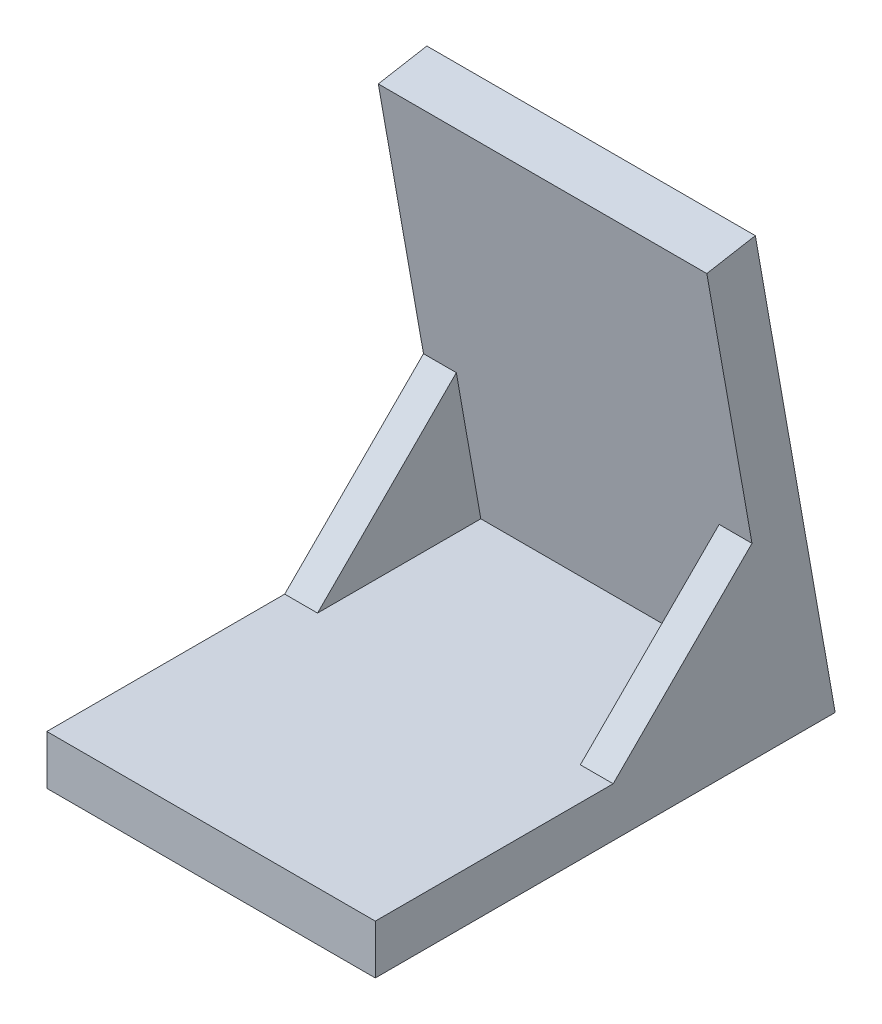
ISO-10303-21;
HEADER;
FILE_DESCRIPTION(('STEP AP214'),'2;1');
FILE_NAME('part.step','',(''),(''),'','','');
FILE_SCHEMA(('AUTOMOTIVE_DESIGN { 1 0 10303 214 1 1 1 1 }'));
ENDSEC;
DATA;
#1=APPLICATION_CONTEXT('core data for automotive mechanical design processes');
#2=APPLICATION_PROTOCOL_DEFINITION('international standard','automotive_design',2000,#1);
#3=PRODUCT_CONTEXT('',#1,'mechanical');
#4=PRODUCT('Part','Part','',(#3));
#5=PRODUCT_RELATED_PRODUCT_CATEGORY('part','',(#4));
#6=PRODUCT_DEFINITION_FORMATION('','',#4);
#7=PRODUCT_DEFINITION_CONTEXT('part definition',#1,'design');
#8=PRODUCT_DEFINITION('design','',#6,#7);
#9=PRODUCT_DEFINITION_SHAPE('','',#8);
#10=(LENGTH_UNIT() NAMED_UNIT(*) SI_UNIT(.MILLI.,.METRE.));
#11=(NAMED_UNIT(*) PLANE_ANGLE_UNIT() SI_UNIT($,.RADIAN.));
#12=(NAMED_UNIT(*) SI_UNIT($,.STERADIAN.) SOLID_ANGLE_UNIT());
#13=UNCERTAINTY_MEASURE_WITH_UNIT(LENGTH_MEASURE(1.E-05),#10,'distance_accuracy_value','');
#14=(GEOMETRIC_REPRESENTATION_CONTEXT(3) GLOBAL_UNCERTAINTY_ASSIGNED_CONTEXT((#13)) GLOBAL_UNIT_ASSIGNED_CONTEXT((#10,
#11,#12)) REPRESENTATION_CONTEXT('',''));
#15=CARTESIAN_POINT('',(0.,0.,0.));
#16=DIRECTION('',(0.,0.,1.));
#17=DIRECTION('',(1.,0.,0.));
#18=AXIS2_PLACEMENT_3D('',#15,#16,#17);
#19=CARTESIAN_POINT('',(-50.,15.,0.));
#20=DIRECTION('',(0.,0.,1.));
#21=DIRECTION('',(1.,0.,0.));
#22=AXIS2_PLACEMENT_3D('',#19,#20,#21);
#23=PLANE('',#22);
#24=DIRECTION('',(1.,0.,0.));
#25=VECTOR('',#24,1.);
#26=CARTESIAN_POINT('',(-50.,0.,0.));
#27=LINE('',#26,#25);
#28=CARTESIAN_POINT('',(-50.,0.,0.));
#29=VERTEX_POINT('',#28);
#30=CARTESIAN_POINT('',(50.,0.,0.));
#31=VERTEX_POINT('',#30);
#32=EDGE_CURVE('E45',#29,#31,#27,.T.);
#33=ORIENTED_EDGE('',*,*,#32,.T.);
#34=DIRECTION('',(0.,-1.,0.));
#35=VECTOR('',#34,1.);
#36=CARTESIAN_POINT('',(50.,15.,0.));
#37=LINE('',#36,#35);
#38=CARTESIAN_POINT('',(50.,15.,0.));
#39=VERTEX_POINT('',#38);
#40=EDGE_CURVE('E176',#39,#31,#37,.T.);
#41=ORIENTED_EDGE('',*,*,#40,.F.);
#42=DIRECTION('',(1.,0.,0.));
#43=VECTOR('',#42,1.);
#44=CARTESIAN_POINT('',(-50.,15.,0.));
#45=LINE('',#44,#43);
#46=CARTESIAN_POINT('',(-50.,15.,0.));
#47=VERTEX_POINT('',#46);
#48=EDGE_CURVE('E11',#47,#39,#45,.T.);
#49=ORIENTED_EDGE('',*,*,#48,.F.);
#50=DIRECTION('',(0.,-1.,0.));
#51=VECTOR('',#50,1.);
#52=CARTESIAN_POINT('',(-50.,15.,0.));
#53=LINE('',#52,#51);
#54=EDGE_CURVE('E144',#47,#29,#53,.T.);
#55=ORIENTED_EDGE('',*,*,#54,.T.);
#56=EDGE_LOOP('',(#33,#41,#49,#55));
#57=FACE_BOUND('',#56,.T.);
#58=ADVANCED_FACE('F42',(#57),#23,.T.);
#59=CARTESIAN_POINT('',(-50.,15.,-122.123696111087));
#60=DIRECTION('',(0.,1.,0.));
#61=DIRECTION('',(0.,0.,1.));
#62=AXIS2_PLACEMENT_3D('',#59,#60,#61);
#63=PLANE('',#62);
#64=DIRECTION('',(1.,0.,0.));
#65=VECTOR('',#64,1.);
#66=CARTESIAN_POINT('',(-50.,15.,-72.4174600392893));
#67=LINE('',#66,#65);
#68=CARTESIAN_POINT('',(40.,15.,-72.4174600392892));
#69=VERTEX_POINT('',#68);
#70=CARTESIAN_POINT('',(50.,15.,-72.4174600392892));
#71=VERTEX_POINT('',#70);
#72=EDGE_CURVE('E125',#69,#71,#67,.T.);
#73=ORIENTED_EDGE('',*,*,#72,.F.);
#74=DIRECTION('',(0.,0.,-1.));
#75=VECTOR('',#74,1.);
#76=CARTESIAN_POINT('',(40.,15.,-122.123696111087));
#77=LINE('',#76,#75);
#78=CARTESIAN_POINT('',(40.,15.,-122.123696111087));
#79=VERTEX_POINT('',#78);
#80=EDGE_CURVE('E209',#69,#79,#77,.T.);
#81=ORIENTED_EDGE('',*,*,#80,.T.);
#82=DIRECTION('',(1.,0.,0.));
#83=VECTOR('',#82,1.);
#84=CARTESIAN_POINT('',(-50.,15.,-122.123696111087));
#85=LINE('',#84,#83);
#86=CARTESIAN_POINT('',(-40.,15.,-122.123696111087));
#87=VERTEX_POINT('',#86);
#88=EDGE_CURVE('E50',#87,#79,#85,.T.);
#89=ORIENTED_EDGE('',*,*,#88,.F.);
#90=DIRECTION('',(0.,0.,1.));
#91=VECTOR('',#90,1.);
#92=CARTESIAN_POINT('',(-40.,15.,-122.123696111087));
#93=LINE('',#92,#91);
#94=CARTESIAN_POINT('',(-40.,15.,-72.4174600392892));
#95=VERTEX_POINT('',#94);
#96=EDGE_CURVE('E66',#87,#95,#93,.T.);
#97=ORIENTED_EDGE('',*,*,#96,.T.);
#98=DIRECTION('',(-1.,0.,0.));
#99=VECTOR('',#98,1.);
#100=CARTESIAN_POINT('',(-50.,15.,-72.4174600392893));
#101=LINE('',#100,#99);
#102=CARTESIAN_POINT('',(-50.,15.,-72.4174600392892));
#103=VERTEX_POINT('',#102);
#104=EDGE_CURVE('E206',#103,#95,#101,.F.);
#105=ORIENTED_EDGE('',*,*,#104,.F.);
#106=DIRECTION('',(0.,0.,1.));
#107=VECTOR('',#106,1.);
#108=CARTESIAN_POINT('',(-50.,15.,-122.123696111087));
#109=LINE('',#108,#107);
#110=EDGE_CURVE('E161',#103,#47,#109,.T.);
#111=ORIENTED_EDGE('',*,*,#110,.T.);
#112=ORIENTED_EDGE('',*,*,#48,.T.);
#113=DIRECTION('',(0.,0.,1.));
#114=VECTOR('',#113,1.);
#115=CARTESIAN_POINT('',(50.,15.,-122.123696111087));
#116=LINE('',#115,#114);
#117=EDGE_CURVE('E142',#71,#39,#116,.T.);
#118=ORIENTED_EDGE('',*,*,#117,.F.);
#119=EDGE_LOOP('',(#73,#81,#89,#97,#105,#111,#112,#118));
#120=FACE_BOUND('',#119,.T.);
#121=ADVANCED_FACE('F218',(#120),#63,.T.);
#122=CARTESIAN_POINT('',(-50.,135.268362756705,-100.917138831446));
#123=DIRECTION('',(0.,-0.173648177666935,0.984807753012207));
#124=DIRECTION('',(0.,-0.984807753012207,-0.173648177666935));
#125=AXIS2_PLACEMENT_3D('',#122,#123,#124);
#126=PLANE('',#125);
#127=DIRECTION('',(-1.,0.,0.));
#128=VECTOR('',#127,1.);
#129=CARTESIAN_POINT('',(-50.,57.2554586326508,-114.67291867194));
#130=LINE('',#129,#128);
#131=CARTESIAN_POINT('',(50.,57.2554586326508,-114.67291867194));
#132=VERTEX_POINT('',#131);
#133=CARTESIAN_POINT('',(40.,57.2554586326507,-114.67291867194));
#134=VERTEX_POINT('',#133);
#135=EDGE_CURVE('E122',#132,#134,#130,.T.);
#136=ORIENTED_EDGE('',*,*,#135,.F.);
#137=DIRECTION('',(0.,-0.984807753012207,-0.173648177666935));
#138=VECTOR('',#137,1.);
#139=CARTESIAN_POINT('',(50.,135.268362756705,-100.917138831446));
#140=LINE('',#139,#138);
#141=CARTESIAN_POINT('',(50.,135.268362756705,-100.917138831446));
#142=VERTEX_POINT('',#141);
#143=EDGE_CURVE('E133',#142,#132,#140,.T.);
#144=ORIENTED_EDGE('',*,*,#143,.F.);
#145=DIRECTION('',(1.,0.,0.));
#146=VECTOR('',#145,1.);
#147=CARTESIAN_POINT('',(-50.,135.268362756705,-100.917138831446));
#148=LINE('',#147,#146);
#149=CARTESIAN_POINT('',(-50.,135.268362756705,-100.917138831446));
#150=VERTEX_POINT('',#149);
#151=EDGE_CURVE('E164',#150,#142,#148,.T.);
#152=ORIENTED_EDGE('',*,*,#151,.F.);
#153=DIRECTION('',(0.,-0.984807753012207,-0.173648177666935));
#154=VECTOR('',#153,1.);
#155=CARTESIAN_POINT('',(-50.,135.268362756705,-100.917138831446));
#156=LINE('',#155,#154);
#157=CARTESIAN_POINT('',(-50.,57.2554586326508,-114.67291867194));
#158=VERTEX_POINT('',#157);
#159=EDGE_CURVE('E159',#150,#158,#156,.T.);
#160=ORIENTED_EDGE('',*,*,#159,.T.);
#161=DIRECTION('',(1.,0.,0.));
#162=VECTOR('',#161,1.);
#163=CARTESIAN_POINT('',(-50.,57.2554586326508,-114.67291867194));
#164=LINE('',#163,#162);
#165=CARTESIAN_POINT('',(-40.,57.2554586326507,-114.67291867194));
#166=VERTEX_POINT('',#165);
#167=EDGE_CURVE('E203',#166,#158,#164,.F.);
#168=ORIENTED_EDGE('',*,*,#167,.F.);
#169=DIRECTION('',(0.,-0.984807753012207,-0.173648177666935));
#170=VECTOR('',#169,1.);
#171=CARTESIAN_POINT('',(-40.,135.268362756705,-100.917138831446));
#172=LINE('',#171,#170);
#173=EDGE_CURVE('E184',#166,#87,#172,.T.);
#174=ORIENTED_EDGE('',*,*,#173,.T.);
#175=ORIENTED_EDGE('',*,*,#88,.T.);
#176=DIRECTION('',(0.,0.984807753012207,0.173648177666935));
#177=VECTOR('',#176,1.);
#178=CARTESIAN_POINT('',(40.,135.268362756705,-100.917138831446));
#179=LINE('',#178,#177);
#180=EDGE_CURVE('E135',#79,#134,#179,.T.);
#181=ORIENTED_EDGE('',*,*,#180,.T.);
#182=EDGE_LOOP('',(#136,#144,#152,#160,#168,#174,#175,#181));
#183=FACE_BOUND('',#182,.T.);
#184=ADVANCED_FACE('F132',(#183),#126,.T.);
#185=CARTESIAN_POINT('',(-50.,137.873085421709,-115.689255126629));
#186=DIRECTION('',(0.,0.984807753012207,0.173648177666935));
#187=DIRECTION('',(0.,-0.173648177666935,0.984807753012207));
#188=AXIS2_PLACEMENT_3D('',#185,#186,#187);
#189=PLANE('',#188);
#190=ORIENTED_EDGE('',*,*,#151,.T.);
#191=DIRECTION('',(0.,-0.173648177666935,0.984807753012207));
#192=VECTOR('',#191,1.);
#193=CARTESIAN_POINT('',(50.,137.873085421709,-115.689255126629));
#194=LINE('',#193,#192);
#195=CARTESIAN_POINT('',(50.,137.873085421709,-115.689255126629));
#196=VERTEX_POINT('',#195);
#197=EDGE_CURVE('E141',#196,#142,#194,.T.);
#198=ORIENTED_EDGE('',*,*,#197,.F.);
#199=DIRECTION('',(1.,0.,0.));
#200=VECTOR('',#199,1.);
#201=CARTESIAN_POINT('',(-50.,137.873085421709,-115.689255126629));
#202=LINE('',#201,#200);
#203=CARTESIAN_POINT('',(-50.,137.873085421709,-115.689255126629));
#204=VERTEX_POINT('',#203);
#205=EDGE_CURVE('E166',#204,#196,#202,.T.);
#206=ORIENTED_EDGE('',*,*,#205,.F.);
#207=DIRECTION('',(0.,-0.173648177666935,0.984807753012207));
#208=VECTOR('',#207,1.);
#209=CARTESIAN_POINT('',(-50.,137.873085421709,-115.689255126629));
#210=LINE('',#209,#208);
#211=EDGE_CURVE('E156',#204,#150,#210,.T.);
#212=ORIENTED_EDGE('',*,*,#211,.T.);
#213=EDGE_LOOP('',(#190,#198,#206,#212));
#214=FACE_BOUND('',#213,.T.);
#215=ADVANCED_FACE('F193',(#214),#189,.T.);
#216=CARTESIAN_POINT('',(-50.,0.,-140.));
#217=DIRECTION('',(0.,0.173648177666935,-0.984807753012207));
#218=DIRECTION('',(0.,0.984807753012207,0.173648177666935));
#219=AXIS2_PLACEMENT_3D('',#216,#217,#218);
#220=PLANE('',#219);
#221=ORIENTED_EDGE('',*,*,#205,.T.);
#222=DIRECTION('',(0.,0.984807753012207,0.173648177666935));
#223=VECTOR('',#222,1.);
#224=CARTESIAN_POINT('',(50.,0.,-140.));
#225=LINE('',#224,#223);
#226=CARTESIAN_POINT('',(50.,0.,-140.));
#227=VERTEX_POINT('',#226);
#228=EDGE_CURVE('E146',#227,#196,#225,.T.);
#229=ORIENTED_EDGE('',*,*,#228,.F.);
#230=DIRECTION('',(1.,0.,0.));
#231=VECTOR('',#230,1.);
#232=CARTESIAN_POINT('',(-50.,0.,-140.));
#233=LINE('',#232,#231);
#234=CARTESIAN_POINT('',(-50.,0.,-140.));
#235=VERTEX_POINT('',#234);
#236=EDGE_CURVE('E168',#235,#227,#233,.T.);
#237=ORIENTED_EDGE('',*,*,#236,.F.);
#238=DIRECTION('',(0.,0.984807753012207,0.173648177666935));
#239=VECTOR('',#238,1.);
#240=CARTESIAN_POINT('',(-50.,0.,-140.));
#241=LINE('',#240,#239);
#242=EDGE_CURVE('E154',#235,#204,#241,.T.);
#243=ORIENTED_EDGE('',*,*,#242,.T.);
#244=EDGE_LOOP('',(#221,#229,#237,#243));
#245=FACE_BOUND('',#244,.T.);
#246=ADVANCED_FACE('F189',(#245),#220,.T.);
#247=CARTESIAN_POINT('',(-50.,0.,0.));
#248=DIRECTION('',(0.,-1.,0.));
#249=DIRECTION('',(0.,0.,-1.));
#250=AXIS2_PLACEMENT_3D('',#247,#248,#249);
#251=PLANE('',#250);
#252=ORIENTED_EDGE('',*,*,#236,.T.);
#253=DIRECTION('',(0.,0.,-1.));
#254=VECTOR('',#253,1.);
#255=CARTESIAN_POINT('',(50.,0.,0.));
#256=LINE('',#255,#254);
#257=EDGE_CURVE('E179',#31,#227,#256,.T.);
#258=ORIENTED_EDGE('',*,*,#257,.F.);
#259=ORIENTED_EDGE('',*,*,#32,.F.);
#260=DIRECTION('',(0.,0.,-1.));
#261=VECTOR('',#260,1.);
#262=CARTESIAN_POINT('',(-50.,0.,0.));
#263=LINE('',#262,#261);
#264=EDGE_CURVE('E152',#29,#235,#263,.T.);
#265=ORIENTED_EDGE('',*,*,#264,.T.);
#266=EDGE_LOOP('',(#252,#258,#259,#265));
#267=FACE_BOUND('',#266,.T.);
#268=ADVANCED_FACE('F180',(#267),#251,.T.);
#269=CARTESIAN_POINT('',(-50.,0.,0.));
#270=DIRECTION('',(1.,0.,0.));
#271=DIRECTION('',(0.,0.,-1.));
#272=AXIS2_PLACEMENT_3D('',#269,#270,#271);
#273=PLANE('',#272);
#274=ORIENTED_EDGE('',*,*,#110,.F.);
#275=DIRECTION('',(0.,-0.707106781186549,0.707106781186546));
#276=VECTOR('',#275,1.);
#277=CARTESIAN_POINT('',(-50.,57.2554586326508,-114.67291867194));
#278=LINE('',#277,#276);
#279=EDGE_CURVE('E201',#158,#103,#278,.T.);
#280=ORIENTED_EDGE('',*,*,#279,.F.);
#281=ORIENTED_EDGE('',*,*,#159,.F.);
#282=ORIENTED_EDGE('',*,*,#211,.F.);
#283=ORIENTED_EDGE('',*,*,#242,.F.);
#284=ORIENTED_EDGE('',*,*,#264,.F.);
#285=ORIENTED_EDGE('',*,*,#54,.F.);
#286=EDGE_LOOP('',(#274,#280,#281,#282,#283,#284,#285));
#287=FACE_BOUND('',#286,.T.);
#288=ADVANCED_FACE('F199',(#287),#273,.F.);
#289=CARTESIAN_POINT('',(50.,0.,0.));
#290=DIRECTION('',(1.,0.,0.));
#291=DIRECTION('',(0.,0.,-1.));
#292=AXIS2_PLACEMENT_3D('',#289,#290,#291);
#293=PLANE('',#292);
#294=ORIENTED_EDGE('',*,*,#257,.T.);
#295=ORIENTED_EDGE('',*,*,#228,.T.);
#296=ORIENTED_EDGE('',*,*,#197,.T.);
#297=ORIENTED_EDGE('',*,*,#143,.T.);
#298=DIRECTION('',(0.,-0.707106781186549,0.707106781186546));
#299=VECTOR('',#298,1.);
#300=CARTESIAN_POINT('',(50.,57.2554586326508,-114.67291867194));
#301=LINE('',#300,#299);
#302=EDGE_CURVE('E58',#132,#71,#301,.T.);
#303=ORIENTED_EDGE('',*,*,#302,.T.);
#304=ORIENTED_EDGE('',*,*,#117,.T.);
#305=ORIENTED_EDGE('',*,*,#40,.T.);
#306=EDGE_LOOP('',(#294,#295,#296,#297,#303,#304,#305));
#307=FACE_BOUND('',#306,.T.);
#308=ADVANCED_FACE('F139',(#307),#293,.T.);
#309=CARTESIAN_POINT('',(-40.,68.9365427108545,-70.));
#310=DIRECTION('',(-1.,0.,0.));
#311=DIRECTION('',(0.,0.,1.));
#312=AXIS2_PLACEMENT_3D('',#309,#310,#311);
#313=PLANE('',#312);
#314=ORIENTED_EDGE('',*,*,#96,.F.);
#315=ORIENTED_EDGE('',*,*,#173,.F.);
#316=DIRECTION('',(0.,-0.707106781186549,0.707106781186546));
#317=VECTOR('',#316,1.);
#318=CARTESIAN_POINT('',(-40.,57.2554586326508,-114.67291867194));
#319=LINE('',#318,#317);
#320=EDGE_CURVE('E204',#166,#95,#319,.T.);
#321=ORIENTED_EDGE('',*,*,#320,.T.);
#322=EDGE_LOOP('',(#314,#315,#321));
#323=FACE_BOUND('',#322,.T.);
#324=ADVANCED_FACE('F219',(#323),#313,.F.);
#325=CARTESIAN_POINT('',(-50.,57.2554586326508,-114.67291867194));
#326=DIRECTION('',(0.,-0.707106781186546,-0.707106781186549));
#327=DIRECTION('',(0.,-0.707106781186549,0.707106781186546));
#328=AXIS2_PLACEMENT_3D('',#325,#326,#327);
#329=PLANE('',#328);
#330=ORIENTED_EDGE('',*,*,#279,.T.);
#331=ORIENTED_EDGE('',*,*,#104,.T.);
#332=ORIENTED_EDGE('',*,*,#320,.F.);
#333=ORIENTED_EDGE('',*,*,#167,.T.);
#334=EDGE_LOOP('',(#330,#331,#332,#333));
#335=FACE_BOUND('',#334,.T.);
#336=ADVANCED_FACE('F220',(#335),#329,.F.);
#337=CARTESIAN_POINT('',(40.,68.9365427108545,-70.));
#338=DIRECTION('',(1.,0.,0.));
#339=DIRECTION('',(0.,0.,-1.));
#340=AXIS2_PLACEMENT_3D('',#337,#338,#339);
#341=PLANE('',#340);
#342=ORIENTED_EDGE('',*,*,#80,.F.);
#343=DIRECTION('',(0.,-0.707106781186549,0.707106781186546));
#344=VECTOR('',#343,1.);
#345=CARTESIAN_POINT('',(40.,57.2554586326508,-114.67291867194));
#346=LINE('',#345,#344);
#347=EDGE_CURVE('E127',#134,#69,#346,.T.);
#348=ORIENTED_EDGE('',*,*,#347,.F.);
#349=ORIENTED_EDGE('',*,*,#180,.F.);
#350=EDGE_LOOP('',(#342,#348,#349));
#351=FACE_BOUND('',#350,.T.);
#352=ADVANCED_FACE('F224',(#351),#341,.F.);
#353=CARTESIAN_POINT('',(50.,57.2554586326508,-114.67291867194));
#354=DIRECTION('',(0.,0.707106781186546,0.707106781186549));
#355=DIRECTION('',(0.,-0.707106781186549,0.707106781186546));
#356=AXIS2_PLACEMENT_3D('',#353,#354,#355);
#357=PLANE('',#356);
#358=ORIENTED_EDGE('',*,*,#347,.T.);
#359=ORIENTED_EDGE('',*,*,#72,.T.);
#360=ORIENTED_EDGE('',*,*,#302,.F.);
#361=ORIENTED_EDGE('',*,*,#135,.T.);
#362=EDGE_LOOP('',(#358,#359,#360,#361));
#363=FACE_BOUND('',#362,.T.);
#364=ADVANCED_FACE('F121',(#363),#357,.T.);
#365=CLOSED_SHELL('',(#58,#121,#184,#215,#246,#268,#288,#308,#324,#336,#352,#364));
#366=MANIFOLD_SOLID_BREP('B2',#365);
#367=ADVANCED_BREP_SHAPE_REPRESENTATION('',(#18,#366),#14);
#368=SHAPE_DEFINITION_REPRESENTATION(#9,#367);
ENDSEC;
END-ISO-10303-21;
